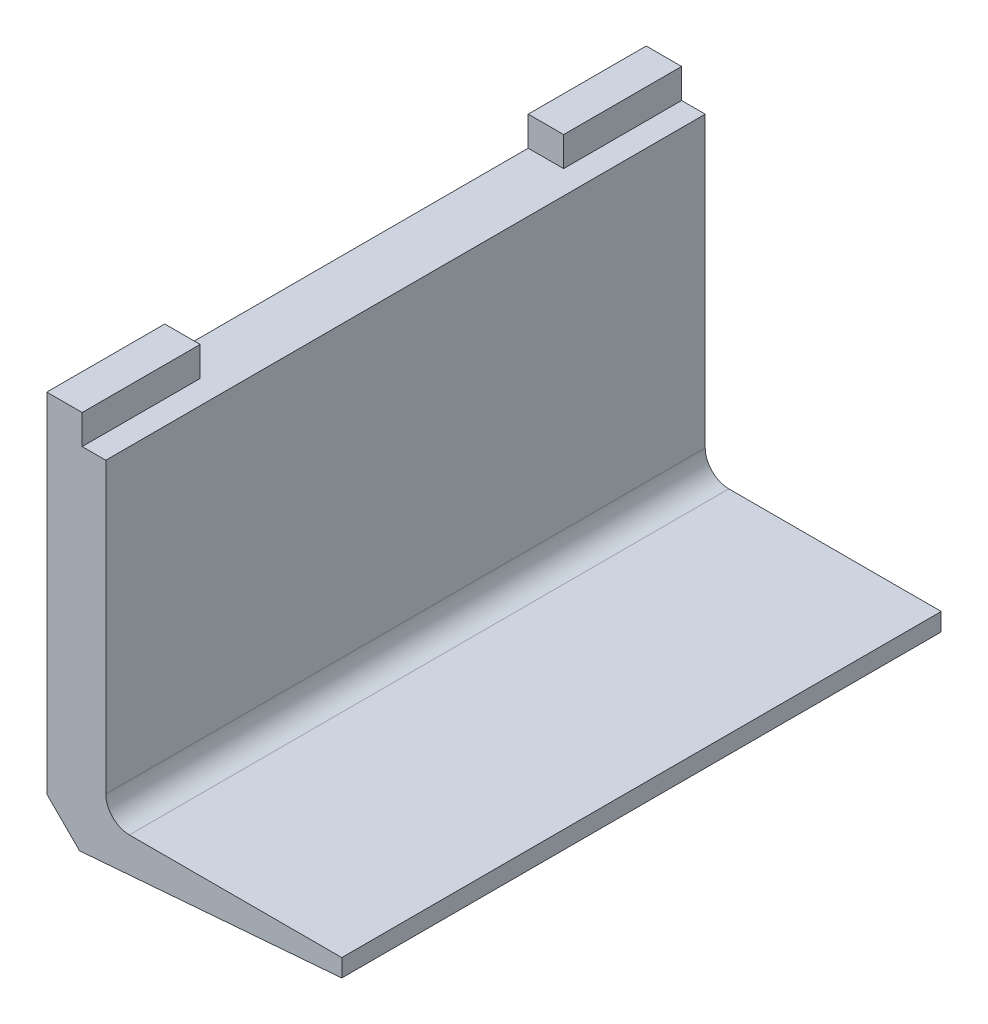
ISO-10303-21;
HEADER;
FILE_DESCRIPTION(('STEP AP214'),'2;1');
FILE_NAME('part.step','',(''),(''),'','','');
FILE_SCHEMA(('AUTOMOTIVE_DESIGN { 1 0 10303 214 1 1 1 1 }'));
ENDSEC;
DATA;
#1=APPLICATION_CONTEXT('core data for automotive mechanical design processes');
#2=APPLICATION_PROTOCOL_DEFINITION('international standard','automotive_design',2000,#1);
#3=PRODUCT_CONTEXT('',#1,'mechanical');
#4=PRODUCT('Part','Part','',(#3));
#5=PRODUCT_RELATED_PRODUCT_CATEGORY('part','',(#4));
#6=PRODUCT_DEFINITION_FORMATION('','',#4);
#7=PRODUCT_DEFINITION_CONTEXT('part definition',#1,'design');
#8=PRODUCT_DEFINITION('design','',#6,#7);
#9=PRODUCT_DEFINITION_SHAPE('','',#8);
#10=(LENGTH_UNIT() NAMED_UNIT(*) SI_UNIT(.MILLI.,.METRE.));
#11=(NAMED_UNIT(*) PLANE_ANGLE_UNIT() SI_UNIT($,.RADIAN.));
#12=(NAMED_UNIT(*) SI_UNIT($,.STERADIAN.) SOLID_ANGLE_UNIT());
#13=UNCERTAINTY_MEASURE_WITH_UNIT(LENGTH_MEASURE(1.E-05),#10,'distance_accuracy_value','');
#14=(GEOMETRIC_REPRESENTATION_CONTEXT(3) GLOBAL_UNCERTAINTY_ASSIGNED_CONTEXT((#13)) GLOBAL_UNIT_ASSIGNED_CONTEXT((#10,
#11,#12)) REPRESENTATION_CONTEXT('',''));
#15=CARTESIAN_POINT('',(0.,0.,0.));
#16=DIRECTION('',(0.,0.,1.));
#17=DIRECTION('',(1.,0.,0.));
#18=AXIS2_PLACEMENT_3D('',#15,#16,#17);
#19=CARTESIAN_POINT('',(-33.4126984126984,18.4267957593902,101.6));
#20=DIRECTION('',(0.,-1.,0.));
#21=DIRECTION('',(0.,0.,-1.));
#22=AXIS2_PLACEMENT_3D('',#19,#20,#21);
#23=PLANE('',#22);
#24=DIRECTION('',(1.,0.,0.));
#25=VECTOR('',#24,1.);
#26=CARTESIAN_POINT('',(-33.4126984126984,18.4267957593902,20.));
#27=LINE('',#26,#25);
#28=CARTESIAN_POINT('',(-33.4126984126984,18.4267957593902,20.));
#29=VERTEX_POINT('',#28);
#30=CARTESIAN_POINT('',(-27.4126984126984,18.4267957593902,20.));
#31=VERTEX_POINT('',#30);
#32=EDGE_CURVE('E52',#29,#31,#27,.T.);
#33=ORIENTED_EDGE('',*,*,#32,.F.);
#34=DIRECTION('',(0.,0.,-1.));
#35=VECTOR('',#34,1.);
#36=CARTESIAN_POINT('',(-33.4126984126984,18.4267957593902,101.6));
#37=LINE('',#36,#35);
#38=CARTESIAN_POINT('',(-33.4126984126984,18.4267957593902,81.6));
#39=VERTEX_POINT('',#38);
#40=EDGE_CURVE('E153',#39,#29,#37,.T.);
#41=ORIENTED_EDGE('',*,*,#40,.F.);
#42=DIRECTION('',(-1.,0.,0.));
#43=VECTOR('',#42,1.);
#44=CARTESIAN_POINT('',(-33.4126984126984,18.4267957593902,81.6));
#45=LINE('',#44,#43);
#46=CARTESIAN_POINT('',(-27.4126984126984,18.4267957593902,81.6));
#47=VERTEX_POINT('',#46);
#48=EDGE_CURVE('E157',#47,#39,#45,.T.);
#49=ORIENTED_EDGE('',*,*,#48,.F.);
#50=DIRECTION('',(0.,0.,-1.));
#51=VECTOR('',#50,1.);
#52=CARTESIAN_POINT('',(-27.4126984126984,18.4267957593902,101.6));
#53=LINE('',#52,#51);
#54=CARTESIAN_POINT('',(-27.4126984126984,18.4267957593902,101.6));
#55=VERTEX_POINT('',#54);
#56=EDGE_CURVE('E154',#55,#47,#53,.T.);
#57=ORIENTED_EDGE('',*,*,#56,.F.);
#58=DIRECTION('',(-1.,0.,0.));
#59=VECTOR('',#58,1.);
#60=CARTESIAN_POINT('',(-33.4126984126984,18.4267957593902,101.6));
#61=LINE('',#60,#59);
#62=CARTESIAN_POINT('',(-23.4126984126984,18.4267957593902,101.6));
#63=VERTEX_POINT('',#62);
#64=EDGE_CURVE('E196',#63,#55,#61,.T.);
#65=ORIENTED_EDGE('',*,*,#64,.F.);
#66=DIRECTION('',(0.,0.,-1.));
#67=VECTOR('',#66,1.);
#68=CARTESIAN_POINT('',(-23.4126984126984,18.4267957593902,101.6));
#69=LINE('',#68,#67);
#70=CARTESIAN_POINT('',(-23.4126984126984,18.4267957593902,0.));
#71=VERTEX_POINT('',#70);
#72=EDGE_CURVE('E211',#63,#71,#69,.T.);
#73=ORIENTED_EDGE('',*,*,#72,.T.);
#74=DIRECTION('',(-1.,0.,0.));
#75=VECTOR('',#74,1.);
#76=CARTESIAN_POINT('',(-33.4126984126984,18.4267957593902,0.));
#77=LINE('',#76,#75);
#78=CARTESIAN_POINT('',(-27.4126984126984,18.4267957593902,0.));
#79=VERTEX_POINT('',#78);
#80=EDGE_CURVE('E187',#71,#79,#77,.T.);
#81=ORIENTED_EDGE('',*,*,#80,.T.);
#82=DIRECTION('',(0.,0.,-1.));
#83=VECTOR('',#82,1.);
#84=CARTESIAN_POINT('',(-27.4126984126984,18.4267957593902,0.));
#85=LINE('',#84,#83);
#86=EDGE_CURVE('E48',#31,#79,#85,.T.);
#87=ORIENTED_EDGE('',*,*,#86,.F.);
#88=EDGE_LOOP('',(#33,#41,#49,#57,#65,#73,#81,#87));
#89=FACE_BOUND('',#88,.T.);
#90=ADVANCED_FACE('F33',(#89),#23,.F.);
#91=CARTESIAN_POINT('',(-33.4126984126984,-33.5732042406098,101.6));
#92=DIRECTION('',(1.,0.,0.));
#93=DIRECTION('',(0.,1.,0.));
#94=AXIS2_PLACEMENT_3D('',#91,#92,#93);
#95=PLANE('',#94);
#96=DIRECTION('',(0.,-1.,0.));
#97=VECTOR('',#96,1.);
#98=CARTESIAN_POINT('',(-33.4126984126984,-33.5732042406098,0.));
#99=LINE('',#98,#97);
#100=CARTESIAN_POINT('',(-33.4126984126984,23.4267957593902,0.));
#101=VERTEX_POINT('',#100);
#102=CARTESIAN_POINT('',(-33.4126984126984,-35.5732042406098,0.));
#103=VERTEX_POINT('',#102);
#104=EDGE_CURVE('E182',#101,#103,#99,.T.);
#105=ORIENTED_EDGE('',*,*,#104,.T.);
#106=DIRECTION('',(0.,0.,1.));
#107=VECTOR('',#106,1.);
#108=CARTESIAN_POINT('',(-33.4126984126984,-35.5732042406098,101.6));
#109=LINE('',#108,#107);
#110=CARTESIAN_POINT('',(-33.4126984126984,-35.5732042406098,101.6));
#111=VERTEX_POINT('',#110);
#112=EDGE_CURVE('E225',#103,#111,#109,.T.);
#113=ORIENTED_EDGE('',*,*,#112,.T.);
#114=DIRECTION('',(0.,-1.,0.));
#115=VECTOR('',#114,1.);
#116=CARTESIAN_POINT('',(-33.4126984126984,18.4267957593902,101.6));
#117=LINE('',#116,#115);
#118=CARTESIAN_POINT('',(-33.4126984126984,23.4267957593902,101.6));
#119=VERTEX_POINT('',#118);
#120=EDGE_CURVE('E183',#119,#111,#117,.T.);
#121=ORIENTED_EDGE('',*,*,#120,.F.);
#122=DIRECTION('',(0.,0.,1.));
#123=VECTOR('',#122,1.);
#124=CARTESIAN_POINT('',(-33.4126984126984,23.4267957593902,101.6));
#125=LINE('',#124,#123);
#126=CARTESIAN_POINT('',(-33.4126984126984,23.4267957593902,81.6));
#127=VERTEX_POINT('',#126);
#128=EDGE_CURVE('E163',#127,#119,#125,.T.);
#129=ORIENTED_EDGE('',*,*,#128,.F.);
#130=DIRECTION('',(0.,-1.,0.));
#131=VECTOR('',#130,1.);
#132=CARTESIAN_POINT('',(-33.4126984126984,23.4267957593902,81.6));
#133=LINE('',#132,#131);
#134=EDGE_CURVE('E171',#127,#39,#133,.T.);
#135=ORIENTED_EDGE('',*,*,#134,.T.);
#136=ORIENTED_EDGE('',*,*,#40,.T.);
#137=DIRECTION('',(0.,-1.,0.));
#138=VECTOR('',#137,1.);
#139=CARTESIAN_POINT('',(-33.4126984126984,23.4267957593902,20.));
#140=LINE('',#139,#138);
#141=CARTESIAN_POINT('',(-33.4126984126984,23.4267957593902,20.));
#142=VERTEX_POINT('',#141);
#143=EDGE_CURVE('E135',#142,#29,#140,.T.);
#144=ORIENTED_EDGE('',*,*,#143,.F.);
#145=DIRECTION('',(0.,0.,1.));
#146=VECTOR('',#145,1.);
#147=CARTESIAN_POINT('',(-33.4126984126984,23.4267957593902,0.));
#148=LINE('',#147,#146);
#149=EDGE_CURVE('E141',#101,#142,#148,.T.);
#150=ORIENTED_EDGE('',*,*,#149,.F.);
#151=EDGE_LOOP('',(#105,#113,#121,#129,#135,#136,#144,#150));
#152=FACE_BOUND('',#151,.T.);
#153=ADVANCED_FACE('F151',(#152),#95,.F.);
#154=CARTESIAN_POINT('',(-33.4126984126984,-41.5732042406098,101.6));
#155=DIRECTION('',(-0.0797452222828901,0.996815278536125,0.));
#156=DIRECTION('',(-0.996815278536125,-0.0797452222828901,0.));
#157=AXIS2_PLACEMENT_3D('',#154,#155,#156);
#158=PLANE('',#157);
#159=DIRECTION('',(0.996815278536125,0.07974522228289,0.));
#160=VECTOR('',#159,1.);
#161=CARTESIAN_POINT('',(-33.4126984126984,-41.5732042406098,101.6));
#162=LINE('',#161,#160);
#163=CARTESIAN_POINT('',(-27.8571428571429,-41.1287597961653,101.6));
#164=VERTEX_POINT('',#163);
#165=CARTESIAN_POINT('',(16.5873015873016,-37.5732042406098,101.6));
#166=VERTEX_POINT('',#165);
#167=EDGE_CURVE('E186',#164,#166,#162,.T.);
#168=ORIENTED_EDGE('',*,*,#167,.F.);
#169=DIRECTION('',(0.,0.,-1.));
#170=VECTOR('',#169,1.);
#171=CARTESIAN_POINT('',(-27.8571428571429,-41.1287597961653,101.6));
#172=LINE('',#171,#170);
#173=CARTESIAN_POINT('',(-27.8571428571429,-41.1287597961653,0.));
#174=VERTEX_POINT('',#173);
#175=EDGE_CURVE('E220',#164,#174,#172,.T.);
#176=ORIENTED_EDGE('',*,*,#175,.T.);
#177=DIRECTION('',(0.996815278536125,0.07974522228289,0.));
#178=VECTOR('',#177,1.);
#179=CARTESIAN_POINT('',(-33.4126984126984,-41.5732042406098,0.));
#180=LINE('',#179,#178);
#181=CARTESIAN_POINT('',(16.5873015873016,-37.5732042406098,0.));
#182=VERTEX_POINT('',#181);
#183=EDGE_CURVE('E200',#174,#182,#180,.T.);
#184=ORIENTED_EDGE('',*,*,#183,.T.);
#185=DIRECTION('',(0.,0.,-1.));
#186=VECTOR('',#185,1.);
#187=CARTESIAN_POINT('',(16.5873015873016,-37.5732042406098,101.6));
#188=LINE('',#187,#186);
#189=EDGE_CURVE('E217',#166,#182,#188,.T.);
#190=ORIENTED_EDGE('',*,*,#189,.F.);
#191=EDGE_LOOP('',(#168,#176,#184,#190));
#192=FACE_BOUND('',#191,.T.);
#193=ADVANCED_FACE('F273',(#192),#158,.F.);
#194=CARTESIAN_POINT('',(16.5873015873016,-34.5732042406098,101.6));
#195=DIRECTION('',(-1.,0.,0.));
#196=DIRECTION('',(0.,-1.,0.));
#197=AXIS2_PLACEMENT_3D('',#194,#195,#196);
#198=PLANE('',#197);
#199=DIRECTION('',(0.,1.,0.));
#200=VECTOR('',#199,1.);
#201=CARTESIAN_POINT('',(16.5873015873016,-34.5732042406098,0.));
#202=LINE('',#201,#200);
#203=CARTESIAN_POINT('',(16.5873015873016,-34.5732042406098,0.));
#204=VERTEX_POINT('',#203);
#205=EDGE_CURVE('E202',#182,#204,#202,.T.);
#206=ORIENTED_EDGE('',*,*,#205,.T.);
#207=DIRECTION('',(0.,0.,-1.));
#208=VECTOR('',#207,1.);
#209=CARTESIAN_POINT('',(16.5873015873016,-34.5732042406098,101.6));
#210=LINE('',#209,#208);
#211=CARTESIAN_POINT('',(16.5873015873016,-34.5732042406098,101.6));
#212=VERTEX_POINT('',#211);
#213=EDGE_CURVE('E214',#212,#204,#210,.T.);
#214=ORIENTED_EDGE('',*,*,#213,.F.);
#215=DIRECTION('',(0.,1.,0.));
#216=VECTOR('',#215,1.);
#217=CARTESIAN_POINT('',(16.5873015873016,-34.5732042406098,101.6));
#218=LINE('',#217,#216);
#219=EDGE_CURVE('E189',#166,#212,#218,.T.);
#220=ORIENTED_EDGE('',*,*,#219,.F.);
#221=ORIENTED_EDGE('',*,*,#189,.T.);
#222=EDGE_LOOP('',(#206,#214,#220,#221));
#223=FACE_BOUND('',#222,.T.);
#224=ADVANCED_FACE('F276',(#223),#198,.F.);
#225=CARTESIAN_POINT('',(-23.4126984126984,-34.5732042406098,101.6));
#226=DIRECTION('',(0.,-1.,0.));
#227=DIRECTION('',(0.,0.,-1.));
#228=AXIS2_PLACEMENT_3D('',#225,#226,#227);
#229=PLANE('',#228);
#230=DIRECTION('',(-1.,0.,0.));
#231=VECTOR('',#230,1.);
#232=CARTESIAN_POINT('',(-23.4126984126984,-34.5732042406098,0.));
#233=LINE('',#232,#231);
#234=CARTESIAN_POINT('',(-19.4126984126984,-34.5732042406098,0.));
#235=VERTEX_POINT('',#234);
#236=EDGE_CURVE('E204',#204,#235,#233,.T.);
#237=ORIENTED_EDGE('',*,*,#236,.T.);
#238=DIRECTION('',(0.,0.,-1.));
#239=VECTOR('',#238,1.);
#240=CARTESIAN_POINT('',(-19.4126984126984,-34.5732042406098,101.6));
#241=LINE('',#240,#239);
#242=CARTESIAN_POINT('',(-19.4126984126984,-34.5732042406098,101.6));
#243=VERTEX_POINT('',#242);
#244=EDGE_CURVE('E232',#235,#243,#241,.F.);
#245=ORIENTED_EDGE('',*,*,#244,.T.);
#246=DIRECTION('',(-1.,0.,0.));
#247=VECTOR('',#246,1.);
#248=CARTESIAN_POINT('',(-23.4126984126984,-34.5732042406098,101.6));
#249=LINE('',#248,#247);
#250=EDGE_CURVE('E191',#212,#243,#249,.T.);
#251=ORIENTED_EDGE('',*,*,#250,.F.);
#252=ORIENTED_EDGE('',*,*,#213,.T.);
#253=EDGE_LOOP('',(#237,#245,#251,#252));
#254=FACE_BOUND('',#253,.T.);
#255=ADVANCED_FACE('F244',(#254),#229,.F.);
#256=CARTESIAN_POINT('',(-23.4126984126984,18.4267957593902,101.6));
#257=DIRECTION('',(-1.,0.,0.));
#258=DIRECTION('',(0.,-1.,0.));
#259=AXIS2_PLACEMENT_3D('',#256,#257,#258);
#260=PLANE('',#259);
#261=DIRECTION('',(0.,1.,0.));
#262=VECTOR('',#261,1.);
#263=CARTESIAN_POINT('',(-23.4126984126984,18.4267957593902,101.6));
#264=LINE('',#263,#262);
#265=CARTESIAN_POINT('',(-23.4126984126984,-30.5732042406098,101.6));
#266=VERTEX_POINT('',#265);
#267=EDGE_CURVE('E194',#266,#63,#264,.T.);
#268=ORIENTED_EDGE('',*,*,#267,.F.);
#269=DIRECTION('',(0.,0.,-1.));
#270=VECTOR('',#269,1.);
#271=CARTESIAN_POINT('',(-23.4126984126984,-30.5732042406098,0.));
#272=LINE('',#271,#270);
#273=CARTESIAN_POINT('',(-23.4126984126984,-30.5732042406098,0.));
#274=VERTEX_POINT('',#273);
#275=EDGE_CURVE('E229',#266,#274,#272,.T.);
#276=ORIENTED_EDGE('',*,*,#275,.T.);
#277=DIRECTION('',(0.,1.,0.));
#278=VECTOR('',#277,1.);
#279=CARTESIAN_POINT('',(-23.4126984126984,18.4267957593902,0.));
#280=LINE('',#279,#278);
#281=EDGE_CURVE('E207',#274,#71,#280,.T.);
#282=ORIENTED_EDGE('',*,*,#281,.T.);
#283=ORIENTED_EDGE('',*,*,#72,.F.);
#284=EDGE_LOOP('',(#268,#276,#282,#283));
#285=FACE_BOUND('',#284,.T.);
#286=ADVANCED_FACE('F253',(#285),#260,.F.);
#287=CARTESIAN_POINT('',(0.,0.,101.6));
#288=DIRECTION('',(0.,0.,1.));
#289=DIRECTION('',(1.,0.,0.));
#290=AXIS2_PLACEMENT_3D('',#287,#288,#289);
#291=PLANE('',#290);
#292=ORIENTED_EDGE('',*,*,#120,.T.);
#293=DIRECTION('',(-0.707106781186546,0.707106781186549,0.));
#294=VECTOR('',#293,1.);
#295=CARTESIAN_POINT('',(-34.4929513266541,-34.492951326654,101.6));
#296=LINE('',#295,#294);
#297=EDGE_CURVE('E227',#111,#164,#296,.F.);
#298=ORIENTED_EDGE('',*,*,#297,.T.);
#299=ORIENTED_EDGE('',*,*,#167,.T.);
#300=ORIENTED_EDGE('',*,*,#219,.T.);
#301=ORIENTED_EDGE('',*,*,#250,.T.);
#302=CARTESIAN_POINT('',(-19.4126984126984,-30.5732042406098,101.6));
#303=DIRECTION('',(0.,0.,1.));
#304=DIRECTION('',(1.,0.,0.));
#305=AXIS2_PLACEMENT_3D('',#302,#303,#304);
#306=CIRCLE('',#305,4.);
#307=EDGE_CURVE('E11',#243,#266,#306,.F.);
#308=ORIENTED_EDGE('',*,*,#307,.T.);
#309=ORIENTED_EDGE('',*,*,#267,.T.);
#310=ORIENTED_EDGE('',*,*,#64,.T.);
#311=DIRECTION('',(0.,-1.,0.));
#312=VECTOR('',#311,1.);
#313=CARTESIAN_POINT('',(-27.4126984126984,23.4267957593902,101.6));
#314=LINE('',#313,#312);
#315=CARTESIAN_POINT('',(-27.4126984126984,23.4267957593902,101.6));
#316=VERTEX_POINT('',#315);
#317=EDGE_CURVE('E179',#316,#55,#314,.T.);
#318=ORIENTED_EDGE('',*,*,#317,.F.);
#319=DIRECTION('',(1.,0.,0.));
#320=VECTOR('',#319,1.);
#321=CARTESIAN_POINT('',(-33.4126984126984,23.4267957593902,101.6));
#322=LINE('',#321,#320);
#323=EDGE_CURVE('E166',#119,#316,#322,.T.);
#324=ORIENTED_EDGE('',*,*,#323,.F.);
#325=EDGE_LOOP('',(#292,#298,#299,#300,#301,#308,#309,#310,#318,#324));
#326=FACE_BOUND('',#325,.T.);
#327=ADVANCED_FACE('F250',(#326),#291,.T.);
#328=CARTESIAN_POINT('',(0.,0.,0.));
#329=DIRECTION('',(0.,0.,1.));
#330=DIRECTION('',(1.,0.,0.));
#331=AXIS2_PLACEMENT_3D('',#328,#329,#330);
#332=PLANE('',#331);
#333=ORIENTED_EDGE('',*,*,#183,.F.);
#334=DIRECTION('',(0.707106781186546,-0.707106781186549,0.));
#335=VECTOR('',#334,1.);
#336=CARTESIAN_POINT('',(-27.8571428571429,-41.1287597961653,0.));
#337=LINE('',#336,#335);
#338=EDGE_CURVE('E223',#174,#103,#337,.F.);
#339=ORIENTED_EDGE('',*,*,#338,.T.);
#340=ORIENTED_EDGE('',*,*,#104,.F.);
#341=DIRECTION('',(-1.,0.,0.));
#342=VECTOR('',#341,1.);
#343=CARTESIAN_POINT('',(-33.4126984126984,23.4267957593902,0.));
#344=LINE('',#343,#342);
#345=CARTESIAN_POINT('',(-27.4126984126984,23.4267957593902,0.));
#346=VERTEX_POINT('',#345);
#347=EDGE_CURVE('E147',#346,#101,#344,.T.);
#348=ORIENTED_EDGE('',*,*,#347,.F.);
#349=DIRECTION('',(0.,-1.,0.));
#350=VECTOR('',#349,1.);
#351=CARTESIAN_POINT('',(-27.4126984126984,23.4267957593902,0.));
#352=LINE('',#351,#350);
#353=EDGE_CURVE('E159',#346,#79,#352,.T.);
#354=ORIENTED_EDGE('',*,*,#353,.T.);
#355=ORIENTED_EDGE('',*,*,#80,.F.);
#356=ORIENTED_EDGE('',*,*,#281,.F.);
#357=CARTESIAN_POINT('',(-19.4126984126984,-30.5732042406098,0.));
#358=DIRECTION('',(0.,0.,1.));
#359=DIRECTION('',(1.,0.,0.));
#360=AXIS2_PLACEMENT_3D('',#357,#358,#359);
#361=CIRCLE('',#360,4.);
#362=EDGE_CURVE('E41',#274,#235,#361,.T.);
#363=ORIENTED_EDGE('',*,*,#362,.T.);
#364=ORIENTED_EDGE('',*,*,#236,.F.);
#365=ORIENTED_EDGE('',*,*,#205,.F.);
#366=EDGE_LOOP('',(#333,#339,#340,#348,#354,#355,#356,#363,#364,#365));
#367=FACE_BOUND('',#366,.T.);
#368=ADVANCED_FACE('F237',(#367),#332,.F.);
#369=CARTESIAN_POINT('',(-27.8571428571429,-41.1287597961653,101.6));
#370=DIRECTION('',(0.707106781186549,0.707106781186546,0.));
#371=DIRECTION('',(0.,0.,-1.));
#372=AXIS2_PLACEMENT_3D('',#369,#370,#371);
#373=PLANE('',#372);
#374=ORIENTED_EDGE('',*,*,#297,.F.);
#375=ORIENTED_EDGE('',*,*,#112,.F.);
#376=ORIENTED_EDGE('',*,*,#338,.F.);
#377=ORIENTED_EDGE('',*,*,#175,.F.);
#378=EDGE_LOOP('',(#374,#375,#376,#377));
#379=FACE_BOUND('',#378,.T.);
#380=ADVANCED_FACE('F271',(#379),#373,.F.);
#381=CARTESIAN_POINT('',(-19.4126984126984,-30.5732042406098,101.6));
#382=DIRECTION('',(0.,0.,1.));
#383=DIRECTION('',(1.,0.,0.));
#384=AXIS2_PLACEMENT_3D('',#381,#382,#383);
#385=CYLINDRICAL_SURFACE('',#384,4.);
#386=ORIENTED_EDGE('',*,*,#307,.F.);
#387=ORIENTED_EDGE('',*,*,#244,.F.);
#388=ORIENTED_EDGE('',*,*,#362,.F.);
#389=ORIENTED_EDGE('',*,*,#275,.F.);
#390=EDGE_LOOP('',(#386,#387,#388,#389));
#391=FACE_BOUND('',#390,.T.);
#392=ADVANCED_FACE('F35',(#391),#385,.F.);
#393=CARTESIAN_POINT('',(-27.4126984126984,23.4267957593902,101.6));
#394=DIRECTION('',(-1.,0.,0.));
#395=DIRECTION('',(0.,0.,1.));
#396=AXIS2_PLACEMENT_3D('',#393,#394,#395);
#397=PLANE('',#396);
#398=ORIENTED_EDGE('',*,*,#56,.T.);
#399=DIRECTION('',(0.,-1.,0.));
#400=VECTOR('',#399,1.);
#401=CARTESIAN_POINT('',(-27.4126984126984,23.4267957593902,81.6));
#402=LINE('',#401,#400);
#403=CARTESIAN_POINT('',(-27.4126984126984,23.4267957593902,81.6));
#404=VERTEX_POINT('',#403);
#405=EDGE_CURVE('E176',#404,#47,#402,.T.);
#406=ORIENTED_EDGE('',*,*,#405,.F.);
#407=DIRECTION('',(0.,0.,-1.));
#408=VECTOR('',#407,1.);
#409=CARTESIAN_POINT('',(-27.4126984126984,23.4267957593902,101.6));
#410=LINE('',#409,#408);
#411=EDGE_CURVE('E168',#316,#404,#410,.T.);
#412=ORIENTED_EDGE('',*,*,#411,.F.);
#413=ORIENTED_EDGE('',*,*,#317,.T.);
#414=EDGE_LOOP('',(#398,#406,#412,#413));
#415=FACE_BOUND('',#414,.T.);
#416=ADVANCED_FACE('F259',(#415),#397,.F.);
#417=CARTESIAN_POINT('',(-33.4126984126984,23.4267957593902,81.6));
#418=DIRECTION('',(0.,0.,1.));
#419=DIRECTION('',(1.,0.,0.));
#420=AXIS2_PLACEMENT_3D('',#417,#418,#419);
#421=PLANE('',#420);
#422=ORIENTED_EDGE('',*,*,#48,.T.);
#423=ORIENTED_EDGE('',*,*,#134,.F.);
#424=DIRECTION('',(-1.,0.,0.));
#425=VECTOR('',#424,1.);
#426=CARTESIAN_POINT('',(-33.4126984126984,23.4267957593902,81.6));
#427=LINE('',#426,#425);
#428=EDGE_CURVE('E170',#404,#127,#427,.T.);
#429=ORIENTED_EDGE('',*,*,#428,.F.);
#430=ORIENTED_EDGE('',*,*,#405,.T.);
#431=EDGE_LOOP('',(#422,#423,#429,#430));
#432=FACE_BOUND('',#431,.T.);
#433=ADVANCED_FACE('F305',(#432),#421,.F.);
#434=CARTESIAN_POINT('',(0.,23.4267957593902,0.));
#435=DIRECTION('',(0.,-1.,0.));
#436=DIRECTION('',(0.,0.,-1.));
#437=AXIS2_PLACEMENT_3D('',#434,#435,#436);
#438=PLANE('',#437);
#439=ORIENTED_EDGE('',*,*,#128,.T.);
#440=ORIENTED_EDGE('',*,*,#323,.T.);
#441=ORIENTED_EDGE('',*,*,#411,.T.);
#442=ORIENTED_EDGE('',*,*,#428,.T.);
#443=EDGE_LOOP('',(#439,#440,#441,#442));
#444=FACE_BOUND('',#443,.T.);
#445=ADVANCED_FACE('F263',(#444),#438,.F.);
#446=CARTESIAN_POINT('',(-33.4126984126984,23.4267957593902,20.));
#447=DIRECTION('',(0.,0.,-1.));
#448=DIRECTION('',(-1.,0.,0.));
#449=AXIS2_PLACEMENT_3D('',#446,#447,#448);
#450=PLANE('',#449);
#451=ORIENTED_EDGE('',*,*,#32,.T.);
#452=DIRECTION('',(0.,-1.,0.));
#453=VECTOR('',#452,1.);
#454=CARTESIAN_POINT('',(-27.4126984126984,23.4267957593902,20.));
#455=LINE('',#454,#453);
#456=CARTESIAN_POINT('',(-27.4126984126984,23.4267957593902,20.));
#457=VERTEX_POINT('',#456);
#458=EDGE_CURVE('E137',#457,#31,#455,.T.);
#459=ORIENTED_EDGE('',*,*,#458,.F.);
#460=DIRECTION('',(1.,0.,0.));
#461=VECTOR('',#460,1.);
#462=CARTESIAN_POINT('',(-33.4126984126984,23.4267957593902,20.));
#463=LINE('',#462,#461);
#464=EDGE_CURVE('E131',#142,#457,#463,.T.);
#465=ORIENTED_EDGE('',*,*,#464,.F.);
#466=ORIENTED_EDGE('',*,*,#143,.T.);
#467=EDGE_LOOP('',(#451,#459,#465,#466));
#468=FACE_BOUND('',#467,.T.);
#469=ADVANCED_FACE('F133',(#468),#450,.F.);
#470=CARTESIAN_POINT('',(-27.4126984126984,23.4267957593902,0.));
#471=DIRECTION('',(-1.,0.,0.));
#472=DIRECTION('',(0.,0.,1.));
#473=AXIS2_PLACEMENT_3D('',#470,#471,#472);
#474=PLANE('',#473);
#475=ORIENTED_EDGE('',*,*,#86,.T.);
#476=ORIENTED_EDGE('',*,*,#353,.F.);
#477=DIRECTION('',(0.,0.,-1.));
#478=VECTOR('',#477,1.);
#479=CARTESIAN_POINT('',(-27.4126984126984,23.4267957593902,0.));
#480=LINE('',#479,#478);
#481=EDGE_CURVE('E140',#457,#346,#480,.T.);
#482=ORIENTED_EDGE('',*,*,#481,.F.);
#483=ORIENTED_EDGE('',*,*,#458,.T.);
#484=EDGE_LOOP('',(#475,#476,#482,#483));
#485=FACE_BOUND('',#484,.T.);
#486=ADVANCED_FACE('F313',(#485),#474,.F.);
#487=CARTESIAN_POINT('',(0.,23.4267957593902,0.));
#488=DIRECTION('',(0.,1.,0.));
#489=DIRECTION('',(0.,0.,1.));
#490=AXIS2_PLACEMENT_3D('',#487,#488,#489);
#491=PLANE('',#490);
#492=ORIENTED_EDGE('',*,*,#149,.T.);
#493=ORIENTED_EDGE('',*,*,#464,.T.);
#494=ORIENTED_EDGE('',*,*,#481,.T.);
#495=ORIENTED_EDGE('',*,*,#347,.T.);
#496=EDGE_LOOP('',(#492,#493,#494,#495));
#497=FACE_BOUND('',#496,.T.);
#498=ADVANCED_FACE('F145',(#497),#491,.T.);
#499=CLOSED_SHELL('',(#90,#153,#193,#224,#255,#286,#327,#368,#380,#392,#416,#433,#445,#469,#486,#498));
#500=MANIFOLD_SOLID_BREP('B2',#499);
#501=ADVANCED_BREP_SHAPE_REPRESENTATION('',(#18,#500),#14);
#502=SHAPE_DEFINITION_REPRESENTATION(#9,#501);
ENDSEC;
END-ISO-10303-21;
